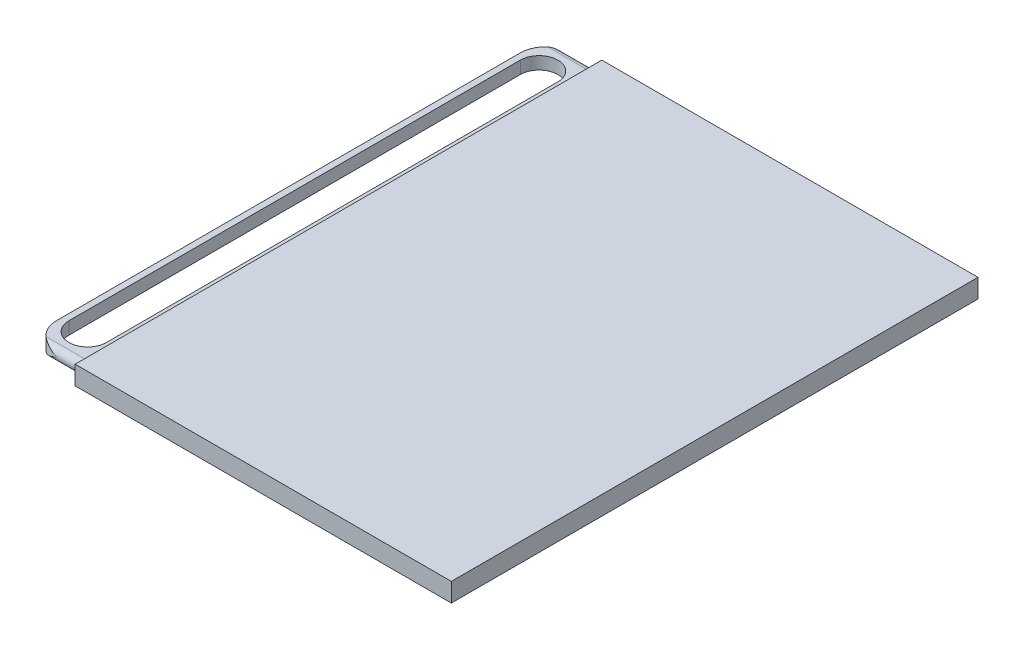
ISO-10303-21;
HEADER;
FILE_DESCRIPTION(('STEP AP214'),'2;1');
FILE_NAME('part.step','',(''),(''),'','','');
FILE_SCHEMA(('AUTOMOTIVE_DESIGN { 1 0 10303 214 1 1 1 1 }'));
ENDSEC;
DATA;
#1=APPLICATION_CONTEXT('core data for automotive mechanical design processes');
#2=APPLICATION_PROTOCOL_DEFINITION('international standard','automotive_design',2000,#1);
#3=PRODUCT_CONTEXT('',#1,'mechanical');
#4=PRODUCT('Part','Part','',(#3));
#5=PRODUCT_RELATED_PRODUCT_CATEGORY('part','',(#4));
#6=PRODUCT_DEFINITION_FORMATION('','',#4);
#7=PRODUCT_DEFINITION_CONTEXT('part definition',#1,'design');
#8=PRODUCT_DEFINITION('design','',#6,#7);
#9=PRODUCT_DEFINITION_SHAPE('','',#8);
#10=(LENGTH_UNIT() NAMED_UNIT(*) SI_UNIT(.MILLI.,.METRE.));
#11=(NAMED_UNIT(*) PLANE_ANGLE_UNIT() SI_UNIT($,.RADIAN.));
#12=(NAMED_UNIT(*) SI_UNIT($,.STERADIAN.) SOLID_ANGLE_UNIT());
#13=UNCERTAINTY_MEASURE_WITH_UNIT(LENGTH_MEASURE(1.E-05),#10,'distance_accuracy_value','');
#14=(GEOMETRIC_REPRESENTATION_CONTEXT(3) GLOBAL_UNCERTAINTY_ASSIGNED_CONTEXT((#13)) GLOBAL_UNIT_ASSIGNED_CONTEXT((#10,
#11,#12)) REPRESENTATION_CONTEXT('',''));
#15=CARTESIAN_POINT('',(0.,0.,0.));
#16=DIRECTION('',(0.,0.,1.));
#17=DIRECTION('',(1.,0.,0.));
#18=AXIS2_PLACEMENT_3D('',#15,#16,#17);
#19=CARTESIAN_POINT('',(-170.,1.25,0.));
#20=DIRECTION('',(0.,1.,0.));
#21=DIRECTION('',(0.,0.,1.));
#22=AXIS2_PLACEMENT_3D('',#19,#20,#21);
#23=PLANE('',#22);
#24=CARTESIAN_POINT('',(-160.,1.25,15.));
#25=DIRECTION('',(0.,1.,0.));
#26=DIRECTION('',(0.,0.,1.));
#27=AXIS2_PLACEMENT_3D('',#24,#25,#26);
#28=CIRCLE('',#27,7.50000000000001);
#29=CARTESIAN_POINT('',(-152.5,1.25,15.));
#30=VERTEX_POINT('',#29);
#31=CARTESIAN_POINT('',(-167.5,1.25,15.));
#32=VERTEX_POINT('',#31);
#33=EDGE_CURVE('E386',#30,#32,#28,.T.);
#34=ORIENTED_EDGE('',*,*,#33,.T.);
#35=DIRECTION('',(0.,0.,1.));
#36=VECTOR('',#35,1.);
#37=CARTESIAN_POINT('',(-167.5,1.25,0.));
#38=LINE('',#37,#36);
#39=CARTESIAN_POINT('',(-167.5,1.25,195.));
#40=VERTEX_POINT('',#39);
#41=EDGE_CURVE('E193',#32,#40,#38,.T.);
#42=ORIENTED_EDGE('',*,*,#41,.T.);
#43=CARTESIAN_POINT('',(-160.,1.25,195.));
#44=DIRECTION('',(0.,1.,0.));
#45=DIRECTION('',(0.,0.,1.));
#46=AXIS2_PLACEMENT_3D('',#43,#44,#45);
#47=CIRCLE('',#46,7.50000000000001);
#48=CARTESIAN_POINT('',(-152.5,1.25,195.));
#49=VERTEX_POINT('',#48);
#50=EDGE_CURVE('E387',#40,#49,#47,.T.);
#51=ORIENTED_EDGE('',*,*,#50,.T.);
#52=DIRECTION('',(0.,0.,1.));
#53=VECTOR('',#52,1.);
#54=CARTESIAN_POINT('',(-152.5,1.25,0.));
#55=LINE('',#54,#53);
#56=EDGE_CURVE('E378',#30,#49,#55,.T.);
#57=ORIENTED_EDGE('',*,*,#56,.F.);
#58=EDGE_LOOP('',(#34,#42,#51,#57));
#59=FACE_BOUND('',#58,.T.);
#60=DIRECTION('',(0.,0.,1.));
#61=VECTOR('',#60,1.);
#62=CARTESIAN_POINT('',(-170.,1.25,0.));
#63=LINE('',#62,#61);
#64=CARTESIAN_POINT('',(-170.,1.25,12.5));
#65=VERTEX_POINT('',#64);
#66=CARTESIAN_POINT('',(-170.,1.25,197.5));
#67=VERTEX_POINT('',#66);
#68=EDGE_CURVE('E179',#65,#67,#63,.T.);
#69=ORIENTED_EDGE('',*,*,#68,.F.);
#70=CARTESIAN_POINT('',(-160.,1.25,12.5));
#71=DIRECTION('',(0.,1.,0.));
#72=DIRECTION('',(0.,0.,1.));
#73=AXIS2_PLACEMENT_3D('',#70,#71,#72);
#74=CIRCLE('',#73,10.);
#75=CARTESIAN_POINT('',(-166.614378277661,1.25,5.00000000000002));
#76=VERTEX_POINT('',#75);
#77=EDGE_CURVE('E70',#65,#76,#74,.F.);
#78=ORIENTED_EDGE('',*,*,#77,.T.);
#79=DIRECTION('',(1.,0.,0.));
#80=VECTOR('',#79,1.);
#81=CARTESIAN_POINT('',(-170.,1.25,5.00000000000002));
#82=LINE('',#81,#80);
#83=CARTESIAN_POINT('',(-150.,1.25,5.00000000000002));
#84=VERTEX_POINT('',#83);
#85=EDGE_CURVE('E178',#76,#84,#82,.T.);
#86=ORIENTED_EDGE('',*,*,#85,.T.);
#87=DIRECTION('',(0.,0.,1.));
#88=VECTOR('',#87,1.);
#89=CARTESIAN_POINT('',(-150.,1.25,0.));
#90=LINE('',#89,#88);
#91=CARTESIAN_POINT('',(-150.,1.25,205.));
#92=VERTEX_POINT('',#91);
#93=EDGE_CURVE('E188',#84,#92,#90,.T.);
#94=ORIENTED_EDGE('',*,*,#93,.T.);
#95=DIRECTION('',(1.,0.,0.));
#96=VECTOR('',#95,1.);
#97=CARTESIAN_POINT('',(-170.,1.25,205.));
#98=LINE('',#97,#96);
#99=CARTESIAN_POINT('',(-166.614378277661,1.25,205.));
#100=VERTEX_POINT('',#99);
#101=EDGE_CURVE('E209',#100,#92,#98,.T.);
#102=ORIENTED_EDGE('',*,*,#101,.F.);
#103=CARTESIAN_POINT('',(-160.,1.25,197.5));
#104=DIRECTION('',(0.,1.,0.));
#105=DIRECTION('',(0.,0.,1.));
#106=AXIS2_PLACEMENT_3D('',#103,#104,#105);
#107=CIRCLE('',#106,10.);
#108=EDGE_CURVE('E257',#100,#67,#107,.F.);
#109=ORIENTED_EDGE('',*,*,#108,.T.);
#110=EDGE_LOOP('',(#69,#78,#86,#94,#102,#109));
#111=FACE_BOUND('',#110,.T.);
#112=ADVANCED_FACE('F54',(#59,#111),#23,.F.);
#113=CARTESIAN_POINT('',(-170.,6.25,0.));
#114=DIRECTION('',(0.,1.,0.));
#115=DIRECTION('',(0.,0.,1.));
#116=AXIS2_PLACEMENT_3D('',#113,#114,#115);
#117=PLANE('',#116);
#118=DIRECTION('',(0.,0.,1.));
#119=VECTOR('',#118,1.);
#120=CARTESIAN_POINT('',(-167.5,6.25,0.));
#121=LINE('',#120,#119);
#122=CARTESIAN_POINT('',(-167.5,6.25,15.));
#123=VERTEX_POINT('',#122);
#124=CARTESIAN_POINT('',(-167.5,6.25,195.));
#125=VERTEX_POINT('',#124);
#126=EDGE_CURVE('E408',#123,#125,#121,.T.);
#127=ORIENTED_EDGE('',*,*,#126,.F.);
#128=CARTESIAN_POINT('',(-160.,6.25,15.));
#129=DIRECTION('',(0.,1.,0.));
#130=DIRECTION('',(0.,0.,1.));
#131=AXIS2_PLACEMENT_3D('',#128,#129,#130);
#132=CIRCLE('',#131,7.50000000000001);
#133=CARTESIAN_POINT('',(-152.5,6.25,15.));
#134=VERTEX_POINT('',#133);
#135=EDGE_CURVE('E406',#134,#123,#132,.T.);
#136=ORIENTED_EDGE('',*,*,#135,.F.);
#137=DIRECTION('',(0.,0.,1.));
#138=VECTOR('',#137,1.);
#139=CARTESIAN_POINT('',(-152.5,6.25,0.));
#140=LINE('',#139,#138);
#141=CARTESIAN_POINT('',(-152.5,6.25,195.));
#142=VERTEX_POINT('',#141);
#143=EDGE_CURVE('E413',#134,#142,#140,.T.);
#144=ORIENTED_EDGE('',*,*,#143,.T.);
#145=CARTESIAN_POINT('',(-160.,6.25,195.));
#146=DIRECTION('',(0.,1.,0.));
#147=DIRECTION('',(0.,0.,1.));
#148=AXIS2_PLACEMENT_3D('',#145,#146,#147);
#149=CIRCLE('',#148,7.50000000000001);
#150=EDGE_CURVE('E417',#125,#142,#149,.T.);
#151=ORIENTED_EDGE('',*,*,#150,.F.);
#152=EDGE_LOOP('',(#127,#136,#144,#151));
#153=FACE_BOUND('',#152,.T.);
#154=CARTESIAN_POINT('',(-160.,6.25,12.5));
#155=DIRECTION('',(0.,1.,0.));
#156=DIRECTION('',(0.,0.,1.));
#157=AXIS2_PLACEMENT_3D('',#154,#155,#156);
#158=CIRCLE('',#157,10.);
#159=CARTESIAN_POINT('',(-170.,6.25,12.5000000000001));
#160=VERTEX_POINT('',#159);
#161=CARTESIAN_POINT('',(-166.614378277661,6.25,5.00000000000002));
#162=VERTEX_POINT('',#161);
#163=EDGE_CURVE('E160',#160,#162,#158,.F.);
#164=ORIENTED_EDGE('',*,*,#163,.F.);
#165=DIRECTION('',(0.,0.,1.));
#166=VECTOR('',#165,1.);
#167=CARTESIAN_POINT('',(-170.,6.25,0.));
#168=LINE('',#167,#166);
#169=CARTESIAN_POINT('',(-170.,6.25,197.5));
#170=VERTEX_POINT('',#169);
#171=EDGE_CURVE('E170',#160,#170,#168,.T.);
#172=ORIENTED_EDGE('',*,*,#171,.T.);
#173=CARTESIAN_POINT('',(-160.,6.25,197.5));
#174=DIRECTION('',(0.,1.,0.));
#175=DIRECTION('',(0.,0.,1.));
#176=AXIS2_PLACEMENT_3D('',#173,#174,#175);
#177=CIRCLE('',#176,10.);
#178=CARTESIAN_POINT('',(-166.614378277661,6.25,205.));
#179=VERTEX_POINT('',#178);
#180=EDGE_CURVE('E77',#179,#170,#177,.F.);
#181=ORIENTED_EDGE('',*,*,#180,.F.);
#182=DIRECTION('',(1.,0.,0.));
#183=VECTOR('',#182,1.);
#184=CARTESIAN_POINT('',(-170.,6.25,205.));
#185=LINE('',#184,#183);
#186=CARTESIAN_POINT('',(-150.,6.25,205.));
#187=VERTEX_POINT('',#186);
#188=EDGE_CURVE('E206',#179,#187,#185,.T.);
#189=ORIENTED_EDGE('',*,*,#188,.T.);
#190=DIRECTION('',(0.,0.,1.));
#191=VECTOR('',#190,1.);
#192=CARTESIAN_POINT('',(-150.,6.25,0.));
#193=LINE('',#192,#191);
#194=CARTESIAN_POINT('',(-150.,6.25,5.00000000000002));
#195=VERTEX_POINT('',#194);
#196=EDGE_CURVE('E197',#195,#187,#193,.T.);
#197=ORIENTED_EDGE('',*,*,#196,.F.);
#198=DIRECTION('',(1.,0.,0.));
#199=VECTOR('',#198,1.);
#200=CARTESIAN_POINT('',(-170.,6.25,5.00000000000002));
#201=LINE('',#200,#199);
#202=EDGE_CURVE('E172',#162,#195,#201,.T.);
#203=ORIENTED_EDGE('',*,*,#202,.F.);
#204=EDGE_LOOP('',(#164,#172,#181,#189,#197,#203));
#205=FACE_BOUND('',#204,.T.);
#206=ADVANCED_FACE('F169',(#153,#205),#117,.T.);
#207=CARTESIAN_POINT('',(-170.,0.,0.));
#208=DIRECTION('',(-1.,0.,0.));
#209=DIRECTION('',(0.,0.,1.));
#210=AXIS2_PLACEMENT_3D('',#207,#208,#209);
#211=PLANE('',#210);
#212=ORIENTED_EDGE('',*,*,#171,.F.);
#213=DIRECTION('',(0.,1.,0.));
#214=VECTOR('',#213,1.);
#215=CARTESIAN_POINT('',(-170.,-13.75,12.5));
#216=LINE('',#215,#214);
#217=EDGE_CURVE('E12',#160,#65,#216,.F.);
#218=ORIENTED_EDGE('',*,*,#217,.T.);
#219=ORIENTED_EDGE('',*,*,#68,.T.);
#220=DIRECTION('',(0.,1.,0.));
#221=VECTOR('',#220,1.);
#222=CARTESIAN_POINT('',(-170.,-13.75,197.5));
#223=LINE('',#222,#221);
#224=EDGE_CURVE('E63',#170,#67,#223,.F.);
#225=ORIENTED_EDGE('',*,*,#224,.F.);
#226=EDGE_LOOP('',(#212,#218,#219,#225));
#227=FACE_BOUND('',#226,.T.);
#228=ADVANCED_FACE('F176',(#227),#211,.T.);
#229=CARTESIAN_POINT('',(0.,7.5,0.));
#230=DIRECTION('',(-1.,0.,0.));
#231=DIRECTION('',(0.,0.,1.));
#232=AXIS2_PLACEMENT_3D('',#229,#230,#231);
#233=PLANE('',#232);
#234=DIRECTION('',(0.,0.,-1.));
#235=VECTOR('',#234,1.);
#236=CARTESIAN_POINT('',(0.,0.,0.));
#237=LINE('',#236,#235);
#238=CARTESIAN_POINT('',(0.,0.,210.));
#239=VERTEX_POINT('',#238);
#240=CARTESIAN_POINT('',(0.,0.,0.));
#241=VERTEX_POINT('',#240);
#242=EDGE_CURVE('E212',#239,#241,#237,.T.);
#243=ORIENTED_EDGE('',*,*,#242,.T.);
#244=DIRECTION('',(0.,-1.,0.));
#245=VECTOR('',#244,1.);
#246=CARTESIAN_POINT('',(0.,7.5,0.));
#247=LINE('',#246,#245);
#248=CARTESIAN_POINT('',(0.,7.5,0.));
#249=VERTEX_POINT('',#248);
#250=EDGE_CURVE('E251',#249,#241,#247,.T.);
#251=ORIENTED_EDGE('',*,*,#250,.F.);
#252=DIRECTION('',(0.,0.,-1.));
#253=VECTOR('',#252,1.);
#254=CARTESIAN_POINT('',(0.,7.5,0.));
#255=LINE('',#254,#253);
#256=CARTESIAN_POINT('',(0.,7.5,210.));
#257=VERTEX_POINT('',#256);
#258=EDGE_CURVE('E213',#257,#249,#255,.T.);
#259=ORIENTED_EDGE('',*,*,#258,.F.);
#260=DIRECTION('',(0.,-1.,0.));
#261=VECTOR('',#260,1.);
#262=CARTESIAN_POINT('',(0.,7.5,210.));
#263=LINE('',#262,#261);
#264=EDGE_CURVE('E227',#257,#239,#263,.T.);
#265=ORIENTED_EDGE('',*,*,#264,.T.);
#266=EDGE_LOOP('',(#243,#251,#259,#265));
#267=FACE_BOUND('',#266,.T.);
#268=ADVANCED_FACE('F56',(#267),#233,.F.);
#269=CARTESIAN_POINT('',(0.,7.5,0.));
#270=DIRECTION('',(0.,0.,1.));
#271=DIRECTION('',(1.,0.,0.));
#272=AXIS2_PLACEMENT_3D('',#269,#270,#271);
#273=PLANE('',#272);
#274=DIRECTION('',(-1.,0.,0.));
#275=VECTOR('',#274,1.);
#276=CARTESIAN_POINT('',(0.,0.,0.));
#277=LINE('',#276,#275);
#278=CARTESIAN_POINT('',(-150.,0.,0.));
#279=VERTEX_POINT('',#278);
#280=EDGE_CURVE('E231',#241,#279,#277,.T.);
#281=ORIENTED_EDGE('',*,*,#280,.T.);
#282=DIRECTION('',(0.,-1.,0.));
#283=VECTOR('',#282,1.);
#284=CARTESIAN_POINT('',(-150.,7.5,0.));
#285=LINE('',#284,#283);
#286=CARTESIAN_POINT('',(-150.,7.5,0.));
#287=VERTEX_POINT('',#286);
#288=EDGE_CURVE('E247',#287,#279,#285,.T.);
#289=ORIENTED_EDGE('',*,*,#288,.F.);
#290=DIRECTION('',(-1.,0.,0.));
#291=VECTOR('',#290,1.);
#292=CARTESIAN_POINT('',(0.,7.5,0.));
#293=LINE('',#292,#291);
#294=EDGE_CURVE('E217',#249,#287,#293,.T.);
#295=ORIENTED_EDGE('',*,*,#294,.F.);
#296=ORIENTED_EDGE('',*,*,#250,.T.);
#297=EDGE_LOOP('',(#281,#289,#295,#296));
#298=FACE_BOUND('',#297,.T.);
#299=ADVANCED_FACE('F337',(#298),#273,.F.);
#300=CARTESIAN_POINT('',(-150.,7.5,155.));
#301=DIRECTION('',(1.,0.,0.));
#302=DIRECTION('',(0.,0.,-1.));
#303=AXIS2_PLACEMENT_3D('',#300,#301,#302);
#304=PLANE('',#303);
#305=ORIENTED_EDGE('',*,*,#93,.F.);
#306=CARTESIAN_POINT('',(-150.,3.75,5.00000000000002));
#307=DIRECTION('',(-1.,0.,0.));
#308=DIRECTION('',(0.,0.,1.));
#309=AXIS2_PLACEMENT_3D('',#306,#307,#308);
#310=CIRCLE('',#309,2.5);
#311=EDGE_CURVE('E184',#195,#84,#310,.T.);
#312=ORIENTED_EDGE('',*,*,#311,.F.);
#313=ORIENTED_EDGE('',*,*,#196,.T.);
#314=CARTESIAN_POINT('',(-150.,3.75,205.));
#315=DIRECTION('',(-1.,0.,0.));
#316=DIRECTION('',(0.,0.,1.));
#317=AXIS2_PLACEMENT_3D('',#314,#315,#316);
#318=CIRCLE('',#317,2.5);
#319=EDGE_CURVE('E192',#92,#187,#318,.T.);
#320=ORIENTED_EDGE('',*,*,#319,.F.);
#321=EDGE_LOOP('',(#305,#312,#313,#320));
#322=FACE_BOUND('',#321,.T.);
#323=DIRECTION('',(0.,0.,1.));
#324=VECTOR('',#323,1.);
#325=CARTESIAN_POINT('',(-150.,0.,155.));
#326=LINE('',#325,#324);
#327=CARTESIAN_POINT('',(-150.,0.,210.));
#328=VERTEX_POINT('',#327);
#329=EDGE_CURVE('E235',#279,#328,#326,.T.);
#330=ORIENTED_EDGE('',*,*,#329,.T.);
#331=DIRECTION('',(0.,-1.,0.));
#332=VECTOR('',#331,1.);
#333=CARTESIAN_POINT('',(-150.,7.5,210.));
#334=LINE('',#333,#332);
#335=CARTESIAN_POINT('',(-150.,7.5,210.));
#336=VERTEX_POINT('',#335);
#337=EDGE_CURVE('E243',#336,#328,#334,.T.);
#338=ORIENTED_EDGE('',*,*,#337,.F.);
#339=DIRECTION('',(0.,0.,1.));
#340=VECTOR('',#339,1.);
#341=CARTESIAN_POINT('',(-150.,7.5,0.));
#342=LINE('',#341,#340);
#343=EDGE_CURVE('E221',#287,#336,#342,.T.);
#344=ORIENTED_EDGE('',*,*,#343,.F.);
#345=ORIENTED_EDGE('',*,*,#288,.T.);
#346=EDGE_LOOP('',(#330,#338,#344,#345));
#347=FACE_BOUND('',#346,.T.);
#348=ADVANCED_FACE('F334',(#322,#347),#304,.F.);
#349=CARTESIAN_POINT('',(0.,7.5,210.));
#350=DIRECTION('',(0.,0.,-1.));
#351=DIRECTION('',(-1.,0.,0.));
#352=AXIS2_PLACEMENT_3D('',#349,#350,#351);
#353=PLANE('',#352);
#354=DIRECTION('',(1.,0.,0.));
#355=VECTOR('',#354,1.);
#356=CARTESIAN_POINT('',(0.,0.,210.));
#357=LINE('',#356,#355);
#358=EDGE_CURVE('E218',#328,#239,#357,.T.);
#359=ORIENTED_EDGE('',*,*,#358,.T.);
#360=ORIENTED_EDGE('',*,*,#264,.F.);
#361=DIRECTION('',(1.,0.,0.));
#362=VECTOR('',#361,1.);
#363=CARTESIAN_POINT('',(0.,7.5,210.));
#364=LINE('',#363,#362);
#365=EDGE_CURVE('E224',#336,#257,#364,.T.);
#366=ORIENTED_EDGE('',*,*,#365,.F.);
#367=ORIENTED_EDGE('',*,*,#337,.T.);
#368=EDGE_LOOP('',(#359,#360,#366,#367));
#369=FACE_BOUND('',#368,.T.);
#370=ADVANCED_FACE('F327',(#369),#353,.F.);
#371=CARTESIAN_POINT('',(0.,7.5,0.));
#372=DIRECTION('',(0.,-1.,0.));
#373=DIRECTION('',(0.,0.,-1.));
#374=AXIS2_PLACEMENT_3D('',#371,#372,#373);
#375=PLANE('',#374);
#376=ORIENTED_EDGE('',*,*,#258,.T.);
#377=ORIENTED_EDGE('',*,*,#294,.T.);
#378=ORIENTED_EDGE('',*,*,#343,.T.);
#379=ORIENTED_EDGE('',*,*,#365,.T.);
#380=EDGE_LOOP('',(#376,#377,#378,#379));
#381=FACE_BOUND('',#380,.T.);
#382=ADVANCED_FACE('F324',(#381),#375,.F.);
#383=CARTESIAN_POINT('',(0.,0.,0.));
#384=DIRECTION('',(0.,-1.,0.));
#385=DIRECTION('',(0.,0.,-1.));
#386=AXIS2_PLACEMENT_3D('',#383,#384,#385);
#387=PLANE('',#386);
#388=ORIENTED_EDGE('',*,*,#242,.F.);
#389=ORIENTED_EDGE('',*,*,#358,.F.);
#390=ORIENTED_EDGE('',*,*,#329,.F.);
#391=ORIENTED_EDGE('',*,*,#280,.F.);
#392=EDGE_LOOP('',(#388,#389,#390,#391));
#393=FACE_BOUND('',#392,.T.);
#394=ADVANCED_FACE('F319',(#393),#387,.T.);
#395=CARTESIAN_POINT('',(-170.,3.75,5.00000000000002));
#396=DIRECTION('',(1.,0.,0.));
#397=DIRECTION('',(0.,0.,-1.));
#398=AXIS2_PLACEMENT_3D('',#395,#396,#397);
#399=CYLINDRICAL_SURFACE('',#398,2.5);
#400=ORIENTED_EDGE('',*,*,#85,.F.);
#401=CARTESIAN_POINT('',(-166.614378277661,1.25,5.00000000000002));
#402=CARTESIAN_POINT('',(-166.553340650688,1.25000330699025,4.94616811334572));
#403=CARTESIAN_POINT('',(-166.491658886197,1.25173827978028,4.89309658721545));
#404=CARTESIAN_POINT('',(-166.367138962112,1.25840558343003,4.78857067387655));
#405=CARTESIAN_POINT('',(-166.304301157904,1.26333694711139,4.73711580242957));
#406=CARTESIAN_POINT('',(-166.114453176213,1.2825025745508,4.58547843887061));
#407=CARTESIAN_POINT('',(-165.985859267841,1.30111057053009,4.48780363040695));
#408=CARTESIAN_POINT('',(-165.726400027566,1.34796146170766,4.30038019771885));
#409=CARTESIAN_POINT('',(-165.595561553611,1.37612504231664,4.2105737472659));
#410=CARTESIAN_POINT('',(-165.331134534077,1.44062646009298,4.03808861581024));
#411=CARTESIAN_POINT('',(-165.197544233483,1.47696967040898,3.9554146697127));
#412=CARTESIAN_POINT('',(-164.85320688555,1.57867835964309,3.75325959857331));
#413=CARTESIAN_POINT('',(-164.640888270588,1.64894043402411,3.63889434469919));
#414=CARTESIAN_POINT('',(-164.212367815424,1.80222832241318,3.42734261704727));
#415=CARTESIAN_POINT('',(-163.996164635456,1.88525861775145,3.33016220056896));
#416=CARTESIAN_POINT('',(-163.559813162188,2.06151615580007,3.15208413296629));
#417=CARTESIAN_POINT('',(-163.339650504031,2.15479254122279,3.07127075590114));
#418=CARTESIAN_POINT('',(-162.897289615717,2.34873950969088,2.92608264038499));
#419=CARTESIAN_POINT('',(-162.675091743295,2.44940881429075,2.861705068296));
#420=CARTESIAN_POINT('',(-162.049066513828,2.73966296311778,2.70335429441744));
#421=CARTESIAN_POINT('',(-161.643443149172,2.93541158657897,2.62745382652997));
#422=CARTESIAN_POINT('',(-160.831072295075,3.33450887237021,2.52621716954636));
#423=CARTESIAN_POINT('',(-160.424330959065,3.53783516831041,2.5007425839787));
#424=CARTESIAN_POINT('',(-160.011925632906,3.74403718489963,2.50000534030974));
#425=CARTESIAN_POINT('',(-160.005962782051,3.74701861039306,2.50000000731283));
#426=CARTESIAN_POINT('',(-160.,3.75,2.50000000000002));
#427=B_SPLINE_CURVE_WITH_KNOTS('',3,(#401,#402,#403,#404,#405,#406,#407,#408,#409,#410,#411,
#412,#413,#414,#415,#416,#417,#418,#419,#420,#421,#422,#423,#424,#425,#426),.UNSPECIFIED.,.F.,
.F.,(4,2,2,2,2,2,2,2,2,2,2,2,4),(0.,0.244096341862818,0.488118858411023,0.975171181731284,
1.45827587966213,1.94169885717417,2.6941080658024,3.44678195675097,4.20323800334599,
4.95956354387029,6.32655490408,7.68978925420557,7.70978926060647),.UNSPECIFIED.);
#428=CARTESIAN_POINT('',(-160.,3.75,2.50000000000002));
#429=VERTEX_POINT('',#428);
#430=EDGE_CURVE('E266',#76,#429,#427,.T.);
#431=ORIENTED_EDGE('',*,*,#430,.T.);
#432=CARTESIAN_POINT('',(-166.614378277661,6.25,5.00000000000002));
#433=CARTESIAN_POINT('',(-166.553340650688,6.24999669300975,4.94616811334572));
#434=CARTESIAN_POINT('',(-166.491658886197,6.24826172021972,4.89309658721545));
#435=CARTESIAN_POINT('',(-166.367138962112,6.24159441656997,4.78857067387656));
#436=CARTESIAN_POINT('',(-166.304301157904,6.23666305288861,4.73711580242957));
#437=CARTESIAN_POINT('',(-166.114453176213,6.2174974254492,4.58547843887063));
#438=CARTESIAN_POINT('',(-165.985859267841,6.19888942946992,4.48780363040698));
#439=CARTESIAN_POINT('',(-165.726400027567,6.15203853829236,4.30038019771889));
#440=CARTESIAN_POINT('',(-165.595561553611,6.12387495768337,4.21057374726592));
#441=CARTESIAN_POINT('',(-165.331134534077,6.05937353990702,4.03808861581025));
#442=CARTESIAN_POINT('',(-165.197544233483,6.02303032959103,3.9554146697127));
#443=CARTESIAN_POINT('',(-164.85320688555,5.92132164035691,3.75325959857331));
#444=CARTESIAN_POINT('',(-164.640888270588,5.85105956597589,3.63889434469918));
#445=CARTESIAN_POINT('',(-164.212367815424,5.6977716775868,3.42734261704725));
#446=CARTESIAN_POINT('',(-163.996164635456,5.61474138224852,3.33016220056893));
#447=CARTESIAN_POINT('',(-163.559813162188,5.4384838441999,3.15208413296626));
#448=CARTESIAN_POINT('',(-163.339650504031,5.3452074587772,3.07127075590112));
#449=CARTESIAN_POINT('',(-162.897289615717,5.15126049030908,2.92608264038498));
#450=CARTESIAN_POINT('',(-162.675091743295,5.05059118570916,2.86170506829599));
#451=CARTESIAN_POINT('',(-162.049066513828,4.76033703688235,2.70335429441744));
#452=CARTESIAN_POINT('',(-161.643443149172,4.56458841342176,2.62745382652997));
#453=CARTESIAN_POINT('',(-160.831072295075,4.16549112762906,2.52621716954636));
#454=CARTESIAN_POINT('',(-160.424330959066,3.96216483168681,2.50074258397869));
#455=CARTESIAN_POINT('',(-160.011925632906,3.75596281510029,2.50000534030974));
#456=CARTESIAN_POINT('',(-160.005962782051,3.7529813896069,2.50000000731283));
#457=CARTESIAN_POINT('',(-160.,3.75,2.50000000000002));
#458=B_SPLINE_CURVE_WITH_KNOTS('',3,(#432,#433,#434,#435,#436,#437,#438,#439,#440,#441,#442,
#443,#444,#445,#446,#447,#448,#449,#450,#451,#452,#453,#454,#455,#456,#457),.UNSPECIFIED.,.F.,
.F.,(4,2,2,2,2,2,2,2,2,2,2,2,4),(0.,0.244096341862817,0.48811885841102,0.975171181731211,
1.45827587966209,1.94169885717417,2.69410806580244,3.44678195675107,4.20323800334605,
4.95956354387032,6.32655490407999,7.68978925420554,7.70978926060647),.UNSPECIFIED.);
#459=EDGE_CURVE('E287',#429,#162,#458,.F.);
#460=ORIENTED_EDGE('',*,*,#459,.T.);
#461=ORIENTED_EDGE('',*,*,#202,.T.);
#462=ORIENTED_EDGE('',*,*,#311,.T.);
#463=EDGE_LOOP('',(#400,#431,#460,#461,#462));
#464=FACE_BOUND('',#463,.T.);
#465=ADVANCED_FACE('F293',(#464),#399,.T.);
#466=CARTESIAN_POINT('',(-170.,3.75,205.));
#467=DIRECTION('',(1.,0.,0.));
#468=DIRECTION('',(0.,0.,-1.));
#469=AXIS2_PLACEMENT_3D('',#466,#467,#468);
#470=CYLINDRICAL_SURFACE('',#469,2.5);
#471=ORIENTED_EDGE('',*,*,#188,.F.);
#472=CARTESIAN_POINT('',(-166.614378277661,6.25,205.));
#473=CARTESIAN_POINT('',(-166.553340650688,6.24999669300974,205.053831886654));
#474=CARTESIAN_POINT('',(-166.491658886197,6.24826172021972,205.106903412784));
#475=CARTESIAN_POINT('',(-166.367138962112,6.24159441656997,205.211429326123));
#476=CARTESIAN_POINT('',(-166.304301157904,6.23666305288862,205.26288419757));
#477=CARTESIAN_POINT('',(-166.114453176213,6.21749742544922,205.414521561129));
#478=CARTESIAN_POINT('',(-165.985859267841,6.19888942946994,205.512196369593));
#479=CARTESIAN_POINT('',(-165.726400027567,6.15203853829239,205.699619802281));
#480=CARTESIAN_POINT('',(-165.595561553611,6.1238749576834,205.789426252734));
#481=CARTESIAN_POINT('',(-165.331134534077,6.05937353990704,205.96191138419));
#482=CARTESIAN_POINT('',(-165.197544233483,6.02303032959103,206.044585330287));
#483=CARTESIAN_POINT('',(-164.85320688555,5.92132164035688,206.246740401427));
#484=CARTESIAN_POINT('',(-164.640888270588,5.85105956597585,206.361105655301));
#485=CARTESIAN_POINT('',(-164.212367815424,5.69777167758673,206.572657382953));
#486=CARTESIAN_POINT('',(-163.996164635456,5.61474138224843,206.669837799431));
#487=CARTESIAN_POINT('',(-163.559813162188,5.43848384419984,206.847915867034));
#488=CARTESIAN_POINT('',(-163.339650504031,5.3452074587772,206.928729244099));
#489=CARTESIAN_POINT('',(-162.897289615717,5.15126049030898,207.073917359615));
#490=CARTESIAN_POINT('',(-162.675091743295,5.05059118570891,207.138294931704));
#491=CARTESIAN_POINT('',(-162.049066513828,4.76033703688272,207.296645705583));
#492=CARTESIAN_POINT('',(-161.643443149171,4.5645884134237,207.37254617347));
#493=CARTESIAN_POINT('',(-160.831072295076,4.16549112762713,207.473782830454));
#494=CARTESIAN_POINT('',(-160.42433095907,3.96216483167944,207.499257416021));
#495=CARTESIAN_POINT('',(-160.011925632906,3.75596281510009,207.49999465969));
#496=CARTESIAN_POINT('',(-160.005962782051,3.7529813896068,207.499999992687));
#497=CARTESIAN_POINT('',(-160.,3.75,207.5));
#498=B_SPLINE_CURVE_WITH_KNOTS('',3,(#472,#473,#474,#475,#476,#477,#478,#479,#480,#481,#482,
#483,#484,#485,#486,#487,#488,#489,#490,#491,#492,#493,#494,#495,#496,#497),.UNSPECIFIED.,.F.,
.F.,(4,2,2,2,2,2,2,2,2,2,2,2,4),(0.,0.244096341862733,0.488118858410845,0.975171181730904,
1.45827587966192,1.9416988571742,2.6941080658026,3.44678195675129,4.20323800334618,
4.95956354387037,6.32655490407996,7.6897892542055,7.70978926060647),.UNSPECIFIED.);
#499=CARTESIAN_POINT('',(-160.,3.75,207.5));
#500=VERTEX_POINT('',#499);
#501=EDGE_CURVE('E262',#179,#500,#498,.T.);
#502=ORIENTED_EDGE('',*,*,#501,.T.);
#503=CARTESIAN_POINT('',(-166.614378277661,1.25,205.));
#504=CARTESIAN_POINT('',(-166.553340650688,1.25000330699026,205.053831886654));
#505=CARTESIAN_POINT('',(-166.491658886197,1.25173827978028,205.106903412784));
#506=CARTESIAN_POINT('',(-166.367138962112,1.25840558343003,205.211429326123));
#507=CARTESIAN_POINT('',(-166.304301157904,1.26333694711138,205.26288419757));
#508=CARTESIAN_POINT('',(-166.114453176213,1.28250257455078,205.414521561129));
#509=CARTESIAN_POINT('',(-165.985859267841,1.30111057053006,205.512196369593));
#510=CARTESIAN_POINT('',(-165.726400027567,1.34796146170761,205.699619802281));
#511=CARTESIAN_POINT('',(-165.595561553611,1.3761250423166,205.789426252734));
#512=CARTESIAN_POINT('',(-165.331134534077,1.44062646009296,205.96191138419));
#513=CARTESIAN_POINT('',(-165.197544233483,1.47696967040897,206.044585330287));
#514=CARTESIAN_POINT('',(-164.85320688555,1.57867835964311,206.246740401427));
#515=CARTESIAN_POINT('',(-164.640888270588,1.64894043402415,206.361105655301));
#516=CARTESIAN_POINT('',(-164.212367815424,1.80222832241327,206.572657382953));
#517=CARTESIAN_POINT('',(-163.996164635456,1.88525861775157,206.669837799431));
#518=CARTESIAN_POINT('',(-163.559813162188,2.06151615580016,206.847915867034));
#519=CARTESIAN_POINT('',(-163.339650504031,2.1547925412228,206.928729244099));
#520=CARTESIAN_POINT('',(-162.897289615717,2.34873950969102,207.073917359615));
#521=CARTESIAN_POINT('',(-162.675091743295,2.44940881429109,207.138294931704));
#522=CARTESIAN_POINT('',(-162.049066513828,2.73966296311728,207.296645705583));
#523=CARTESIAN_POINT('',(-161.643443149171,2.9354115865763,207.37254617347));
#524=CARTESIAN_POINT('',(-160.831072295076,3.33450887237287,207.473782830454));
#525=CARTESIAN_POINT('',(-160.42433095907,3.53783516832056,207.499257416021));
#526=CARTESIAN_POINT('',(-160.011925632906,3.74403718489991,207.49999465969));
#527=CARTESIAN_POINT('',(-160.005962782051,3.7470186103932,207.499999992687));
#528=CARTESIAN_POINT('',(-160.,3.75,207.5));
#529=B_SPLINE_CURVE_WITH_KNOTS('',3,(#503,#504,#505,#506,#507,#508,#509,#510,#511,#512,#513,
#514,#515,#516,#517,#518,#519,#520,#521,#522,#523,#524,#525,#526,#527,#528),.UNSPECIFIED.,.F.,
.F.,(4,2,2,2,2,2,2,2,2,2,2,2,4),(0.,0.244096341862733,0.488118858410845,0.975171181730904,
1.45827587966196,1.9416988571742,2.6941080658026,3.44678195675129,4.20323800334618,
4.95956354387037,6.32655490407996,7.6897892542055,7.70978926060647),.UNSPECIFIED.);
#530=EDGE_CURVE('E174',#500,#100,#529,.F.);
#531=ORIENTED_EDGE('',*,*,#530,.T.);
#532=ORIENTED_EDGE('',*,*,#101,.T.);
#533=ORIENTED_EDGE('',*,*,#319,.T.);
#534=EDGE_LOOP('',(#471,#502,#531,#532,#533));
#535=FACE_BOUND('',#534,.T.);
#536=ADVANCED_FACE('F313',(#535),#470,.T.);
#537=CARTESIAN_POINT('',(-167.5,0.,0.));
#538=DIRECTION('',(-1.,0.,0.));
#539=DIRECTION('',(0.,0.,1.));
#540=AXIS2_PLACEMENT_3D('',#537,#538,#539);
#541=PLANE('',#540);
#542=DIRECTION('',(0.,1.,0.));
#543=VECTOR('',#542,1.);
#544=CARTESIAN_POINT('',(-167.5,0.,15.));
#545=LINE('',#544,#543);
#546=EDGE_CURVE('E393',#32,#123,#545,.T.);
#547=ORIENTED_EDGE('',*,*,#546,.T.);
#548=ORIENTED_EDGE('',*,*,#126,.T.);
#549=DIRECTION('',(0.,1.,0.));
#550=VECTOR('',#549,1.);
#551=CARTESIAN_POINT('',(-167.5,0.,195.));
#552=LINE('',#551,#550);
#553=EDGE_CURVE('E398',#40,#125,#552,.T.);
#554=ORIENTED_EDGE('',*,*,#553,.F.);
#555=ORIENTED_EDGE('',*,*,#41,.F.);
#556=EDGE_LOOP('',(#547,#548,#554,#555));
#557=FACE_BOUND('',#556,.T.);
#558=ADVANCED_FACE('F317',(#557),#541,.F.);
#559=CARTESIAN_POINT('',(-160.,0.,15.));
#560=DIRECTION('',(0.,1.,0.));
#561=DIRECTION('',(0.,0.,1.));
#562=AXIS2_PLACEMENT_3D('',#559,#560,#561);
#563=CYLINDRICAL_SURFACE('',#562,7.50000000000001);
#564=DIRECTION('',(0.,1.,0.));
#565=VECTOR('',#564,1.);
#566=CARTESIAN_POINT('',(-152.5,0.,15.));
#567=LINE('',#566,#565);
#568=EDGE_CURVE('E383',#30,#134,#567,.T.);
#569=ORIENTED_EDGE('',*,*,#568,.T.);
#570=ORIENTED_EDGE('',*,*,#135,.T.);
#571=ORIENTED_EDGE('',*,*,#546,.F.);
#572=ORIENTED_EDGE('',*,*,#33,.F.);
#573=EDGE_LOOP('',(#569,#570,#571,#572));
#574=FACE_BOUND('',#573,.T.);
#575=ADVANCED_FACE('F304',(#574),#563,.F.);
#576=CARTESIAN_POINT('',(-152.5,0.,0.));
#577=DIRECTION('',(-1.,0.,0.));
#578=DIRECTION('',(0.,0.,1.));
#579=AXIS2_PLACEMENT_3D('',#576,#577,#578);
#580=PLANE('',#579);
#581=ORIENTED_EDGE('',*,*,#56,.T.);
#582=DIRECTION('',(0.,1.,0.));
#583=VECTOR('',#582,1.);
#584=CARTESIAN_POINT('',(-152.5,0.,195.));
#585=LINE('',#584,#583);
#586=EDGE_CURVE('E381',#49,#142,#585,.T.);
#587=ORIENTED_EDGE('',*,*,#586,.T.);
#588=ORIENTED_EDGE('',*,*,#143,.F.);
#589=ORIENTED_EDGE('',*,*,#568,.F.);
#590=EDGE_LOOP('',(#581,#587,#588,#589));
#591=FACE_BOUND('',#590,.T.);
#592=ADVANCED_FACE('F367',(#591),#580,.T.);
#593=CARTESIAN_POINT('',(-160.,0.,195.));
#594=DIRECTION('',(0.,1.,0.));
#595=DIRECTION('',(0.,0.,1.));
#596=AXIS2_PLACEMENT_3D('',#593,#594,#595);
#597=CYLINDRICAL_SURFACE('',#596,7.50000000000001);
#598=ORIENTED_EDGE('',*,*,#553,.T.);
#599=ORIENTED_EDGE('',*,*,#150,.T.);
#600=ORIENTED_EDGE('',*,*,#586,.F.);
#601=ORIENTED_EDGE('',*,*,#50,.F.);
#602=EDGE_LOOP('',(#598,#599,#600,#601));
#603=FACE_BOUND('',#602,.T.);
#604=ADVANCED_FACE('F303',(#603),#597,.F.);
#605=CARTESIAN_POINT('',(-160.,-13.75,197.5));
#606=DIRECTION('',(0.,1.,0.));
#607=DIRECTION('',(0.,0.,1.));
#608=AXIS2_PLACEMENT_3D('',#605,#606,#607);
#609=CYLINDRICAL_SURFACE('',#608,10.);
#610=ORIENTED_EDGE('',*,*,#530,.F.);
#611=ORIENTED_EDGE('',*,*,#501,.F.);
#612=ORIENTED_EDGE('',*,*,#180,.T.);
#613=ORIENTED_EDGE('',*,*,#224,.T.);
#614=ORIENTED_EDGE('',*,*,#108,.F.);
#615=EDGE_LOOP('',(#610,#611,#612,#613,#614));
#616=FACE_BOUND('',#615,.T.);
#617=ADVANCED_FACE('F256',(#616),#609,.T.);
#618=CARTESIAN_POINT('',(-160.,-13.75,12.5));
#619=DIRECTION('',(0.,1.,0.));
#620=DIRECTION('',(0.,0.,1.));
#621=AXIS2_PLACEMENT_3D('',#618,#619,#620);
#622=CYLINDRICAL_SURFACE('',#621,10.);
#623=ORIENTED_EDGE('',*,*,#430,.F.);
#624=ORIENTED_EDGE('',*,*,#77,.F.);
#625=ORIENTED_EDGE('',*,*,#217,.F.);
#626=ORIENTED_EDGE('',*,*,#163,.T.);
#627=ORIENTED_EDGE('',*,*,#459,.F.);
#628=EDGE_LOOP('',(#623,#624,#625,#626,#627));
#629=FACE_BOUND('',#628,.T.);
#630=ADVANCED_FACE('F159',(#629),#622,.T.);
#631=CLOSED_SHELL('',(#112,#206,#228,#268,#299,#348,#370,#382,#394,#465,#536,#558,#575,#592,
#604,#617,#630));
#632=MANIFOLD_SOLID_BREP('B2',#631);
#633=ADVANCED_BREP_SHAPE_REPRESENTATION('',(#18,#632),#14);
#634=SHAPE_DEFINITION_REPRESENTATION(#9,#633);
ENDSEC;
END-ISO-10303-21;
